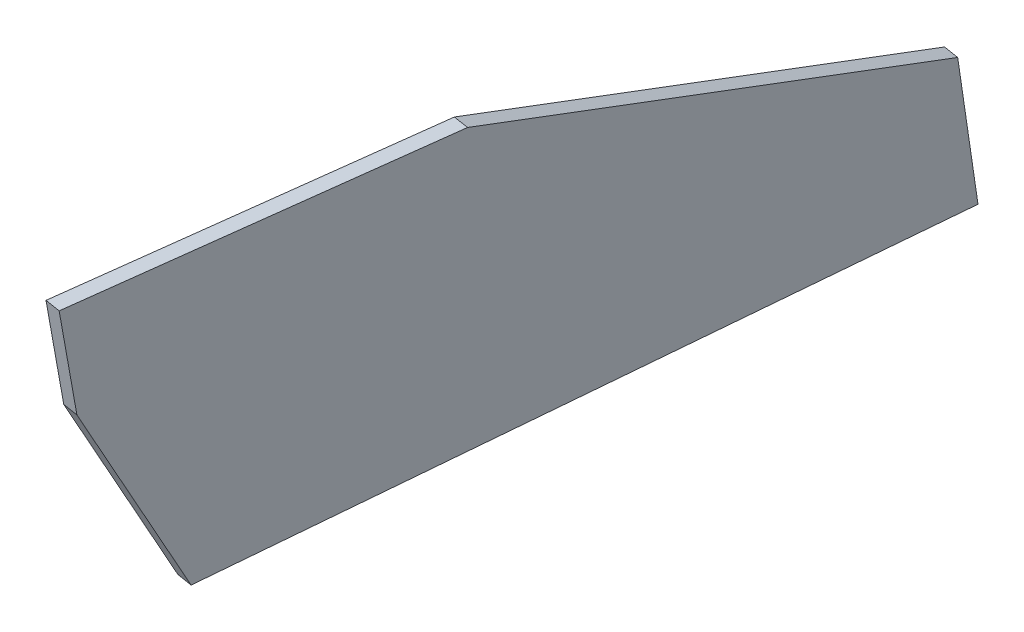
ISO-10303-21;
HEADER;
FILE_DESCRIPTION(('STEP AP214'),'2;1');
FILE_NAME('part.step','',(''),(''),'','','');
FILE_SCHEMA(('AUTOMOTIVE_DESIGN { 1 0 10303 214 1 1 1 1 }'));
ENDSEC;
DATA;
#1=APPLICATION_CONTEXT('core data for automotive mechanical design processes');
#2=APPLICATION_PROTOCOL_DEFINITION('international standard','automotive_design',2000,#1);
#3=PRODUCT_CONTEXT('',#1,'mechanical');
#4=PRODUCT('Part','Part','',(#3));
#5=PRODUCT_RELATED_PRODUCT_CATEGORY('part','',(#4));
#6=PRODUCT_DEFINITION_FORMATION('','',#4);
#7=PRODUCT_DEFINITION_CONTEXT('part definition',#1,'design');
#8=PRODUCT_DEFINITION('design','',#6,#7);
#9=PRODUCT_DEFINITION_SHAPE('','',#8);
#10=(LENGTH_UNIT() NAMED_UNIT(*) SI_UNIT(.MILLI.,.METRE.));
#11=(NAMED_UNIT(*) PLANE_ANGLE_UNIT() SI_UNIT($,.RADIAN.));
#12=(NAMED_UNIT(*) SI_UNIT($,.STERADIAN.) SOLID_ANGLE_UNIT());
#13=UNCERTAINTY_MEASURE_WITH_UNIT(LENGTH_MEASURE(1.E-05),#10,'distance_accuracy_value','');
#14=(GEOMETRIC_REPRESENTATION_CONTEXT(3) GLOBAL_UNCERTAINTY_ASSIGNED_CONTEXT((#13)) GLOBAL_UNIT_ASSIGNED_CONTEXT((#10,
#11,#12)) REPRESENTATION_CONTEXT('',''));
#15=CARTESIAN_POINT('',(0.,0.,0.));
#16=DIRECTION('',(0.,0.,1.));
#17=DIRECTION('',(1.,0.,0.));
#18=AXIS2_PLACEMENT_3D('',#15,#16,#17);
#19=CARTESIAN_POINT('',(0.,0.,0.));
#20=DIRECTION('',(0.992432509138968,-0.0868265938642405,0.086826593864241));
#21=DIRECTION('',(-0.0871557427476515,0.,0.996194698091746));
#22=AXIS2_PLACEMENT_3D('',#19,#20,#21);
#23=PLANE('',#22);
#24=DIRECTION('',(-0.0839663559491868,0.0360755085509896,0.995815348722544));
#25=VECTOR('',#24,1.);
#26=CARTESIAN_POINT('',(-4.81759112324753,115.006271912534,170.071590424575));
#27=LINE('',#26,#25);
#28=CARTESIAN_POINT('',(6.11302436407988,110.310015798724,40.4378275892309));
#29=VERTEX_POINT('',#28);
#30=CARTESIAN_POINT('',(-15.7482066105749,119.702528026343,299.705353259919));
#31=VERTEX_POINT('',#30);
#32=EDGE_CURVE('E112',#29,#31,#27,.T.);
#33=ORIENTED_EDGE('',*,*,#32,.F.);
#34=DIRECTION('',(-0.0545658529524883,0.321608594898021,0.945299148089793));
#35=VECTOR('',#34,1.);
#36=CARTESIAN_POINT('',(15.3191172614352,56.0497332040935,-119.048578326258));
#37=LINE('',#36,#35);
#38=CARTESIAN_POINT('',(24.5252101587905,1.78945060946268,-278.534984241748));
#39=VERTEX_POINT('',#38);
#40=EDGE_CURVE('E91',#39,#29,#37,.T.);
#41=ORIENTED_EDGE('',*,*,#40,.F.);
#42=DIRECTION('',(0.0677772099004546,0.976979126239648,0.202282072142153));
#43=VECTOR('',#42,1.);
#44=CARTESIAN_POINT('',(21.0021243366274,-48.9943056599308,-289.049685296696));
#45=LINE('',#44,#43);
#46=CARTESIAN_POINT('',(17.4790385144642,-99.7780619293242,-299.564386351645));
#47=VERTEX_POINT('',#46);
#48=EDGE_CURVE('E101',#47,#39,#45,.T.);
#49=ORIENTED_EDGE('',*,*,#48,.F.);
#50=DIRECTION('',(0.087110660113036,-0.000519104814101112,-0.996198506034246));
#51=VECTOR('',#50,1.);
#52=CARTESIAN_POINT('',(-4.29862651379475,-99.6482857257989,-50.5147598430839));
#53=LINE('',#52,#51);
#54=CARTESIAN_POINT('',(-26.0762915420538,-99.5185095222736,198.534866665478));
#55=VERTEX_POINT('',#54);
#56=EDGE_CURVE('E108',#55,#47,#53,.T.);
#57=ORIENTED_EDGE('',*,*,#56,.F.);
#58=DIRECTION('',(-0.0322106718301427,-0.866429327691845,-0.498259663966198));
#59=VECTOR('',#58,1.);
#60=CARTESIAN_POINT('',(-23.3595187325028,-26.4405044659505,240.56001641391));
#61=LINE('',#60,#59);
#62=CARTESIAN_POINT('',(-20.6427459229518,46.6375005903725,282.585166162343));
#63=VERTEX_POINT('',#62);
#64=EDGE_CURVE('E139',#63,#55,#61,.T.);
#65=ORIENTED_EDGE('',*,*,#64,.F.);
#66=DIRECTION('',(-0.0650839922381134,-0.971565120847082,-0.22765168549287));
#67=VECTOR('',#66,1.);
#68=CARTESIAN_POINT('',(-18.1954762667634,83.1700143083578,291.145259711131));
#69=LINE('',#68,#67);
#70=EDGE_CURVE('E120',#31,#63,#69,.T.);
#71=ORIENTED_EDGE('',*,*,#70,.F.);
#72=EDGE_LOOP('',(#33,#41,#49,#57,#65,#71));
#73=FACE_BOUND('',#72,.T.);
#74=ADVANCED_FACE('F37',(#73),#23,.F.);
#75=CARTESIAN_POINT('',(27.4033636058539,-100.646327867967,-298.696120413003));
#76=DIRECTION('',(0.102391233131756,0.194866440132588,-0.975470709907689));
#77=DIRECTION('',(0.0677772099004547,0.976979126239648,0.202282072142153));
#78=AXIS2_PLACEMENT_3D('',#75,#76,#77);
#79=PLANE('',#78);
#80=DIRECTION('',(0.0677772099004547,0.976979126239648,0.202282072142153));
#81=VECTOR('',#80,1.);
#82=CARTESIAN_POINT('',(32.0113278173112,-34.2245194803827,-284.943583971632));
#83=LINE('',#82,#81);
#84=CARTESIAN_POINT('',(27.4033636058539,-100.646327867967,-298.696120413003));
#85=VERTEX_POINT('',#84);
#86=CARTESIAN_POINT('',(34.4495352501801,0.921184670820291,-277.666718303105));
#87=VERTEX_POINT('',#86);
#88=EDGE_CURVE('E181',#85,#87,#83,.T.);
#89=ORIENTED_EDGE('',*,*,#88,.F.);
#90=DIRECTION('',(-0.992432509138968,0.0868265938642407,-0.0868265938642421));
#91=VECTOR('',#90,1.);
#92=CARTESIAN_POINT('',(22.4412010601591,-100.212194898645,-299.130253382324));
#93=LINE('',#92,#91);
#94=EDGE_CURVE('E97',#85,#47,#93,.T.);
#95=ORIENTED_EDGE('',*,*,#94,.T.);
#96=ORIENTED_EDGE('',*,*,#48,.T.);
#97=DIRECTION('',(-0.992432509138968,0.0868265938642393,-0.0868265938642421));
#98=VECTOR('',#97,1.);
#99=CARTESIAN_POINT('',(29.4873727044853,1.35531764014149,-278.100851272426));
#100=LINE('',#99,#98);
#101=EDGE_CURVE('E86',#87,#39,#100,.T.);
#102=ORIENTED_EDGE('',*,*,#101,.F.);
#103=EDGE_LOOP('',(#89,#95,#96,#102));
#104=FACE_BOUND('',#103,.T.);
#105=ADVANCED_FACE('F102',(#104),#79,.T.);
#106=CARTESIAN_POINT('',(-16.1519664506641,-100.386775460916,199.40313260412));
#107=DIRECTION('',(-0.0865415951944657,-0.996223304850939,-0.007048345413716));
#108=DIRECTION('',(0.087110660113036,-0.000519104814101112,-0.996198506034246));
#109=AXIS2_PLACEMENT_3D('',#106,#107,#108);
#110=PLANE('',#109);
#111=DIRECTION('',(0.087110660113036,-0.000519104814101098,-0.996198506034246));
#112=VECTOR('',#111,1.);
#113=CARTESIAN_POINT('',(5.62569857759493,-100.516551664441,-49.6464939044414));
#114=LINE('',#113,#112);
#115=CARTESIAN_POINT('',(-16.1519664506641,-100.386775460916,199.40313260412));
#116=VERTEX_POINT('',#115);
#117=EDGE_CURVE('E165',#116,#85,#114,.T.);
#118=ORIENTED_EDGE('',*,*,#117,.F.);
#119=DIRECTION('',(-0.992432509138968,0.0868265938642406,-0.0868265938642393));
#120=VECTOR('',#119,1.);
#121=CARTESIAN_POINT('',(-21.1141289963589,-99.9526424915948,198.968999634799));
#122=LINE('',#121,#120);
#123=EDGE_CURVE('E152',#116,#55,#122,.T.);
#124=ORIENTED_EDGE('',*,*,#123,.T.);
#125=ORIENTED_EDGE('',*,*,#56,.T.);
#126=ORIENTED_EDGE('',*,*,#94,.F.);
#127=EDGE_LOOP('',(#118,#124,#125,#126));
#128=FACE_BOUND('',#127,.T.);
#129=ADVANCED_FACE('F164',(#128),#110,.T.);
#130=CARTESIAN_POINT('',(-10.7184208315621,45.7692346517301,283.453432100985));
#131=DIRECTION('',(-0.118491296829694,-0.491692345591623,0.862669374593897));
#132=DIRECTION('',(-0.0322106718301428,-0.866429327691845,-0.498259663966198));
#133=AXIS2_PLACEMENT_3D('',#130,#131,#132);
#134=PLANE('',#133);
#135=DIRECTION('',(-0.0322106718301427,-0.866429327691845,-0.498259663966198));
#136=VECTOR('',#135,1.);
#137=CARTESIAN_POINT('',(-10.7184208315621,45.7692346517301,283.453432100985));
#138=LINE('',#137,#136);
#139=CARTESIAN_POINT('',(-10.7184208315621,45.7692346517301,283.453432100985));
#140=VERTEX_POINT('',#139);
#141=EDGE_CURVE('E47',#140,#116,#138,.T.);
#142=ORIENTED_EDGE('',*,*,#141,.F.);
#143=DIRECTION('',(-0.992432509138968,0.08682659386424,-0.0868265938642421));
#144=VECTOR('',#143,1.);
#145=CARTESIAN_POINT('',(-15.680583377257,46.2033676210513,283.019299131664));
#146=LINE('',#145,#144);
#147=EDGE_CURVE('E143',#140,#63,#146,.T.);
#148=ORIENTED_EDGE('',*,*,#147,.T.);
#149=ORIENTED_EDGE('',*,*,#64,.T.);
#150=ORIENTED_EDGE('',*,*,#123,.F.);
#151=EDGE_LOOP('',(#142,#148,#149,#150));
#152=FACE_BOUND('',#151,.T.);
#153=ADVANCED_FACE('F169',(#152),#134,.T.);
#154=CARTESIAN_POINT('',(-5.82388151918524,118.834262087701,300.573619198562));
#155=DIRECTION('',(-0.104123910599252,-0.220277912082282,0.969863832035296));
#156=DIRECTION('',(-0.0650839922381134,-0.971565120847082,-0.22765168549287));
#157=AXIS2_PLACEMENT_3D('',#154,#155,#156);
#158=PLANE('',#157);
#159=DIRECTION('',(-0.0650839922381134,-0.971565120847082,-0.22765168549287));
#160=VECTOR('',#159,1.);
#161=CARTESIAN_POINT('',(-8.27115117537369,82.3017483697153,292.013525649774));
#162=LINE('',#161,#160);
#163=CARTESIAN_POINT('',(-5.82388151918524,118.834262087701,300.573619198562));
#164=VERTEX_POINT('',#163);
#165=EDGE_CURVE('E11',#164,#140,#162,.T.);
#166=ORIENTED_EDGE('',*,*,#165,.F.);
#167=DIRECTION('',(-0.992432509138968,0.086826593864242,-0.086826593864242));
#168=VECTOR('',#167,1.);
#169=CARTESIAN_POINT('',(-10.7860440648801,119.268395057022,300.139486229241));
#170=LINE('',#169,#168);
#171=EDGE_CURVE('E133',#164,#31,#170,.T.);
#172=ORIENTED_EDGE('',*,*,#171,.T.);
#173=ORIENTED_EDGE('',*,*,#70,.T.);
#174=ORIENTED_EDGE('',*,*,#147,.F.);
#175=EDGE_LOOP('',(#166,#172,#173,#174));
#176=FACE_BOUND('',#175,.T.);
#177=ADVANCED_FACE('F194',(#176),#158,.T.);
#178=CARTESIAN_POINT('',(16.0373494554696,109.441749860082,41.3060935278733));
#179=DIRECTION('',(0.0895955683767121,0.995570037858071,-0.0285119947834626));
#180=DIRECTION('',(-0.0839663559491868,0.0360755085509896,0.995815348722544));
#181=AXIS2_PLACEMENT_3D('',#178,#179,#180);
#182=PLANE('',#181);
#183=DIRECTION('',(-0.0839663559491868,0.0360755085509896,0.995815348722544));
#184=VECTOR('',#183,1.);
#185=CARTESIAN_POINT('',(16.0373494554696,109.441749860082,41.3060935278734));
#186=LINE('',#185,#184);
#187=CARTESIAN_POINT('',(16.0373494554696,109.441749860082,41.3060935278733));
#188=VERTEX_POINT('',#187);
#189=EDGE_CURVE('E55',#188,#164,#186,.T.);
#190=ORIENTED_EDGE('',*,*,#189,.F.);
#191=DIRECTION('',(-0.992432509138969,0.0868265938642407,-0.0868265938642358));
#192=VECTOR('',#191,1.);
#193=CARTESIAN_POINT('',(11.0751869097747,109.875882829403,40.8719605585521));
#194=LINE('',#193,#192);
#195=EDGE_CURVE('E131',#188,#29,#194,.T.);
#196=ORIENTED_EDGE('',*,*,#195,.T.);
#197=ORIENTED_EDGE('',*,*,#32,.T.);
#198=ORIENTED_EDGE('',*,*,#171,.F.);
#199=EDGE_LOOP('',(#190,#196,#197,#198));
#200=FACE_BOUND('',#199,.T.);
#201=ADVANCED_FACE('F173',(#200),#182,.T.);
#202=CARTESIAN_POINT('',(34.4495352501801,0.921184670820286,-277.666718303105));
#203=DIRECTION('',(0.110001284063865,0.942883372578844,-0.31443705764214));
#204=DIRECTION('',(-0.0545658529524883,0.321608594898021,0.945299148089793));
#205=AXIS2_PLACEMENT_3D('',#202,#203,#204);
#206=PLANE('',#205);
#207=DIRECTION('',(-0.0545658529524883,0.321608594898021,0.945299148089793));
#208=VECTOR('',#207,1.);
#209=CARTESIAN_POINT('',(34.4495352501801,0.921184670820286,-277.666718303105));
#210=LINE('',#209,#208);
#211=EDGE_CURVE('E93',#87,#188,#210,.T.);
#212=ORIENTED_EDGE('',*,*,#211,.F.);
#213=ORIENTED_EDGE('',*,*,#101,.T.);
#214=ORIENTED_EDGE('',*,*,#40,.T.);
#215=ORIENTED_EDGE('',*,*,#195,.F.);
#216=EDGE_LOOP('',(#212,#213,#214,#215));
#217=FACE_BOUND('',#216,.T.);
#218=ADVANCED_FACE('F88',(#217),#206,.T.);
#219=CARTESIAN_POINT('',(9.92432509138968,-0.868265938642405,0.86826593864241));
#220=DIRECTION('',(0.992432509138968,-0.0868265938642405,0.086826593864241));
#221=DIRECTION('',(-0.0871557427476515,0.,0.996194698091746));
#222=AXIS2_PLACEMENT_3D('',#219,#220,#221);
#223=PLANE('',#222);
#224=ORIENTED_EDGE('',*,*,#189,.T.);
#225=ORIENTED_EDGE('',*,*,#165,.T.);
#226=ORIENTED_EDGE('',*,*,#141,.T.);
#227=ORIENTED_EDGE('',*,*,#117,.T.);
#228=ORIENTED_EDGE('',*,*,#88,.T.);
#229=ORIENTED_EDGE('',*,*,#211,.T.);
#230=EDGE_LOOP('',(#224,#225,#226,#227,#228,#229));
#231=FACE_BOUND('',#230,.T.);
#232=ADVANCED_FACE('F193',(#231),#223,.T.);
#233=CLOSED_SHELL('',(#74,#105,#129,#153,#177,#201,#218,#232));
#234=MANIFOLD_SOLID_BREP('B2',#233);
#235=ADVANCED_BREP_SHAPE_REPRESENTATION('',(#18,#234),#14);
#236=SHAPE_DEFINITION_REPRESENTATION(#9,#235);
ENDSEC;
END-ISO-10303-21;
